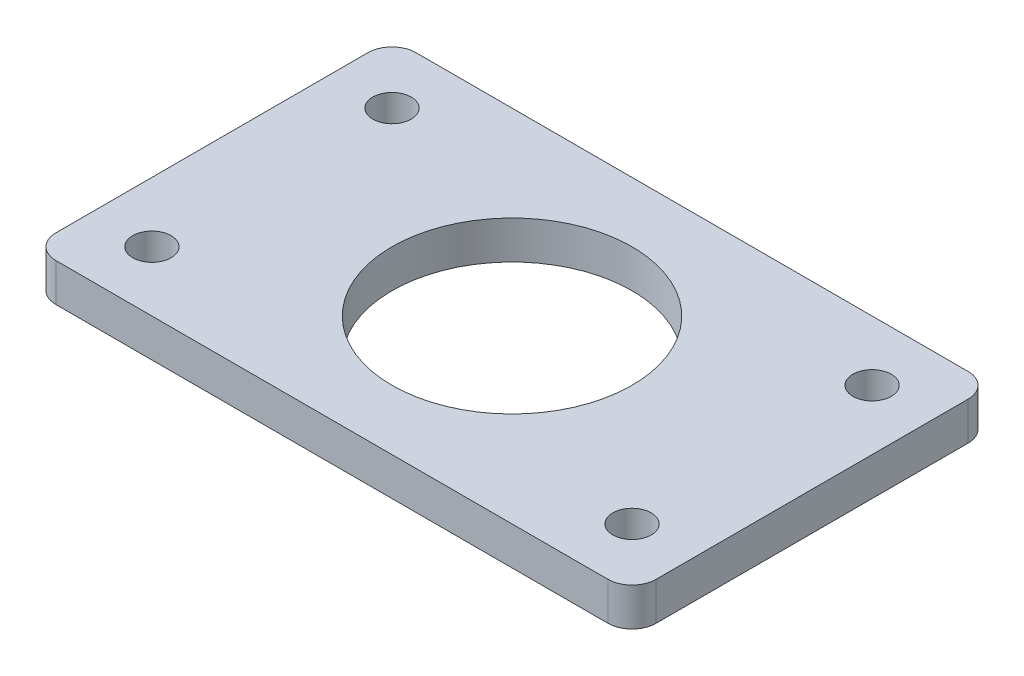
ISO-10303-21;
HEADER;
FILE_DESCRIPTION(('STEP AP214'),'2;1');
FILE_NAME('part.step','',(''),(''),'','','');
FILE_SCHEMA(('AUTOMOTIVE_DESIGN { 1 0 10303 214 1 1 1 1 }'));
ENDSEC;
DATA;
#1=APPLICATION_CONTEXT('core data for automotive mechanical design processes');
#2=APPLICATION_PROTOCOL_DEFINITION('international standard','automotive_design',2000,#1);
#3=PRODUCT_CONTEXT('',#1,'mechanical');
#4=PRODUCT('Part','Part','',(#3));
#5=PRODUCT_RELATED_PRODUCT_CATEGORY('part','',(#4));
#6=PRODUCT_DEFINITION_FORMATION('','',#4);
#7=PRODUCT_DEFINITION_CONTEXT('part definition',#1,'design');
#8=PRODUCT_DEFINITION('design','',#6,#7);
#9=PRODUCT_DEFINITION_SHAPE('','',#8);
#10=(LENGTH_UNIT() NAMED_UNIT(*) SI_UNIT(.MILLI.,.METRE.));
#11=(NAMED_UNIT(*) PLANE_ANGLE_UNIT() SI_UNIT($,.RADIAN.));
#12=(NAMED_UNIT(*) SI_UNIT($,.STERADIAN.) SOLID_ANGLE_UNIT());
#13=UNCERTAINTY_MEASURE_WITH_UNIT(LENGTH_MEASURE(1.E-05),#10,'distance_accuracy_value','');
#14=(GEOMETRIC_REPRESENTATION_CONTEXT(3) GLOBAL_UNCERTAINTY_ASSIGNED_CONTEXT((#13)) GLOBAL_UNIT_ASSIGNED_CONTEXT((#10,
#11,#12)) REPRESENTATION_CONTEXT('',''));
#15=CARTESIAN_POINT('',(0.,0.,0.));
#16=DIRECTION('',(0.,0.,1.));
#17=DIRECTION('',(1.,0.,0.));
#18=AXIS2_PLACEMENT_3D('',#15,#16,#17);
#19=CARTESIAN_POINT('',(0.,3.175,0.));
#20=DIRECTION('',(0.,1.,0.));
#21=DIRECTION('',(0.,0.,1.));
#22=AXIS2_PLACEMENT_3D('',#19,#20,#21);
#23=PLANE('',#22);
#24=CARTESIAN_POINT('',(-20.,3.175,-10.));
#25=DIRECTION('',(0.,1.,0.));
#26=DIRECTION('',(0.,0.,1.));
#27=AXIS2_PLACEMENT_3D('',#24,#25,#26);
#28=CIRCLE('',#27,1.6);
#29=CARTESIAN_POINT('',(-20.,3.175,-8.4));
#30=VERTEX_POINT('',#29);
#31=EDGE_CURVE('E207',#30,#30,#28,.T.);
#32=ORIENTED_EDGE('',*,*,#31,.F.);
#33=EDGE_LOOP('',(#32));
#34=FACE_BOUND('',#33,.T.);
#35=CARTESIAN_POINT('',(20.,3.175,10.));
#36=DIRECTION('',(0.,1.,0.));
#37=DIRECTION('',(0.,0.,1.));
#38=AXIS2_PLACEMENT_3D('',#35,#36,#37);
#39=CIRCLE('',#38,1.6);
#40=CARTESIAN_POINT('',(20.,3.175,11.6));
#41=VERTEX_POINT('',#40);
#42=EDGE_CURVE('E201',#41,#41,#39,.T.);
#43=ORIENTED_EDGE('',*,*,#42,.F.);
#44=EDGE_LOOP('',(#43));
#45=FACE_BOUND('',#44,.T.);
#46=CARTESIAN_POINT('',(20.,3.175,-10.));
#47=DIRECTION('',(0.,1.,0.));
#48=DIRECTION('',(0.,0.,1.));
#49=AXIS2_PLACEMENT_3D('',#46,#47,#48);
#50=CIRCLE('',#49,1.6);
#51=CARTESIAN_POINT('',(20.,3.175,-8.4));
#52=VERTEX_POINT('',#51);
#53=EDGE_CURVE('E195',#52,#52,#50,.T.);
#54=ORIENTED_EDGE('',*,*,#53,.F.);
#55=EDGE_LOOP('',(#54));
#56=FACE_BOUND('',#55,.T.);
#57=CARTESIAN_POINT('',(-20.,3.175,10.));
#58=DIRECTION('',(0.,1.,0.));
#59=DIRECTION('',(0.,0.,1.));
#60=AXIS2_PLACEMENT_3D('',#57,#58,#59);
#61=CIRCLE('',#60,1.6);
#62=CARTESIAN_POINT('',(-20.,3.175,11.6));
#63=VERTEX_POINT('',#62);
#64=EDGE_CURVE('E189',#63,#63,#61,.T.);
#65=ORIENTED_EDGE('',*,*,#64,.F.);
#66=EDGE_LOOP('',(#65));
#67=FACE_BOUND('',#66,.T.);
#68=DIRECTION('',(-1.,0.,0.));
#69=VECTOR('',#68,1.);
#70=CARTESIAN_POINT('',(25.,3.175,-15.));
#71=LINE('',#70,#69);
#72=CARTESIAN_POINT('',(23.,3.175,-15.));
#73=VERTEX_POINT('',#72);
#74=CARTESIAN_POINT('',(-23.,3.175,-15.));
#75=VERTEX_POINT('',#74);
#76=EDGE_CURVE('E140',#73,#75,#71,.T.);
#77=ORIENTED_EDGE('',*,*,#76,.T.);
#78=CARTESIAN_POINT('',(-23.,3.175,-13.));
#79=DIRECTION('',(0.,1.,0.));
#80=DIRECTION('',(0.,0.,1.));
#81=AXIS2_PLACEMENT_3D('',#78,#79,#80);
#82=CIRCLE('',#81,2.);
#83=CARTESIAN_POINT('',(-25.,3.175,-13.));
#84=VERTEX_POINT('',#83);
#85=EDGE_CURVE('E159',#75,#84,#82,.T.);
#86=ORIENTED_EDGE('',*,*,#85,.T.);
#87=DIRECTION('',(0.,0.,1.));
#88=VECTOR('',#87,1.);
#89=CARTESIAN_POINT('',(-25.,3.175,15.));
#90=LINE('',#89,#88);
#91=CARTESIAN_POINT('',(-25.,3.175,13.));
#92=VERTEX_POINT('',#91);
#93=EDGE_CURVE('E123',#84,#92,#90,.T.);
#94=ORIENTED_EDGE('',*,*,#93,.T.);
#95=CARTESIAN_POINT('',(-23.,3.175,13.));
#96=DIRECTION('',(0.,1.,0.));
#97=DIRECTION('',(0.,0.,1.));
#98=AXIS2_PLACEMENT_3D('',#95,#96,#97);
#99=CIRCLE('',#98,2.);
#100=CARTESIAN_POINT('',(-23.,3.175,15.));
#101=VERTEX_POINT('',#100);
#102=EDGE_CURVE('E154',#92,#101,#99,.T.);
#103=ORIENTED_EDGE('',*,*,#102,.T.);
#104=DIRECTION('',(1.,0.,0.));
#105=VECTOR('',#104,1.);
#106=CARTESIAN_POINT('',(25.,3.175,15.));
#107=LINE('',#106,#105);
#108=CARTESIAN_POINT('',(23.,3.175,15.));
#109=VERTEX_POINT('',#108);
#110=EDGE_CURVE('E170',#101,#109,#107,.T.);
#111=ORIENTED_EDGE('',*,*,#110,.T.);
#112=CARTESIAN_POINT('',(23.,3.175,13.));
#113=DIRECTION('',(0.,1.,0.));
#114=DIRECTION('',(0.,0.,1.));
#115=AXIS2_PLACEMENT_3D('',#112,#113,#114);
#116=CIRCLE('',#115,2.);
#117=CARTESIAN_POINT('',(25.,3.175,13.));
#118=VERTEX_POINT('',#117);
#119=EDGE_CURVE('E59',#109,#118,#116,.T.);
#120=ORIENTED_EDGE('',*,*,#119,.T.);
#121=DIRECTION('',(0.,0.,-1.));
#122=VECTOR('',#121,1.);
#123=CARTESIAN_POINT('',(25.,3.175,15.));
#124=LINE('',#123,#122);
#125=CARTESIAN_POINT('',(25.,3.175,-13.));
#126=VERTEX_POINT('',#125);
#127=EDGE_CURVE('E178',#118,#126,#124,.T.);
#128=ORIENTED_EDGE('',*,*,#127,.T.);
#129=CARTESIAN_POINT('',(23.,3.175,-13.));
#130=DIRECTION('',(0.,1.,0.));
#131=DIRECTION('',(0.,0.,1.));
#132=AXIS2_PLACEMENT_3D('',#129,#130,#131);
#133=CIRCLE('',#132,2.);
#134=EDGE_CURVE('E157',#126,#73,#133,.T.);
#135=ORIENTED_EDGE('',*,*,#134,.T.);
#136=EDGE_LOOP('',(#77,#86,#94,#103,#111,#120,#128,#135));
#137=FACE_BOUND('',#136,.T.);
#138=CARTESIAN_POINT('',(0.,3.175,0.));
#139=DIRECTION('',(0.,1.,0.));
#140=DIRECTION('',(0.,0.,1.));
#141=AXIS2_PLACEMENT_3D('',#138,#139,#140);
#142=CIRCLE('',#141,10.);
#143=CARTESIAN_POINT('',(0.,3.175,10.));
#144=VERTEX_POINT('',#143);
#145=EDGE_CURVE('E131',#144,#144,#142,.T.);
#146=ORIENTED_EDGE('',*,*,#145,.F.);
#147=EDGE_LOOP('',(#146));
#148=FACE_BOUND('',#147,.T.);
#149=ADVANCED_FACE('F37',(#34,#45,#56,#67,#137,#148),#23,.T.);
#150=CARTESIAN_POINT('',(0.,0.,0.));
#151=DIRECTION('',(0.,1.,0.));
#152=DIRECTION('',(0.,0.,1.));
#153=AXIS2_PLACEMENT_3D('',#150,#151,#152);
#154=PLANE('',#153);
#155=CARTESIAN_POINT('',(-20.,0.,-10.));
#156=DIRECTION('',(0.,1.,0.));
#157=DIRECTION('',(0.,0.,1.));
#158=AXIS2_PLACEMENT_3D('',#155,#156,#157);
#159=CIRCLE('',#158,1.6);
#160=CARTESIAN_POINT('',(-20.,0.,-8.4));
#161=VERTEX_POINT('',#160);
#162=EDGE_CURVE('E204',#161,#161,#159,.T.);
#163=ORIENTED_EDGE('',*,*,#162,.T.);
#164=EDGE_LOOP('',(#163));
#165=FACE_BOUND('',#164,.T.);
#166=CARTESIAN_POINT('',(20.,0.,10.));
#167=DIRECTION('',(0.,1.,0.));
#168=DIRECTION('',(0.,0.,1.));
#169=AXIS2_PLACEMENT_3D('',#166,#167,#168);
#170=CIRCLE('',#169,1.6);
#171=CARTESIAN_POINT('',(20.,0.,11.6));
#172=VERTEX_POINT('',#171);
#173=EDGE_CURVE('E198',#172,#172,#170,.T.);
#174=ORIENTED_EDGE('',*,*,#173,.T.);
#175=EDGE_LOOP('',(#174));
#176=FACE_BOUND('',#175,.T.);
#177=CARTESIAN_POINT('',(20.,0.,-10.));
#178=DIRECTION('',(0.,1.,0.));
#179=DIRECTION('',(0.,0.,1.));
#180=AXIS2_PLACEMENT_3D('',#177,#178,#179);
#181=CIRCLE('',#180,1.6);
#182=CARTESIAN_POINT('',(20.,0.,-8.4));
#183=VERTEX_POINT('',#182);
#184=EDGE_CURVE('E192',#183,#183,#181,.T.);
#185=ORIENTED_EDGE('',*,*,#184,.T.);
#186=EDGE_LOOP('',(#185));
#187=FACE_BOUND('',#186,.T.);
#188=CARTESIAN_POINT('',(-20.,0.,10.));
#189=DIRECTION('',(0.,1.,0.));
#190=DIRECTION('',(0.,0.,1.));
#191=AXIS2_PLACEMENT_3D('',#188,#189,#190);
#192=CIRCLE('',#191,1.6);
#193=CARTESIAN_POINT('',(-20.,0.,11.6));
#194=VERTEX_POINT('',#193);
#195=EDGE_CURVE('E185',#194,#194,#192,.T.);
#196=ORIENTED_EDGE('',*,*,#195,.T.);
#197=EDGE_LOOP('',(#196));
#198=FACE_BOUND('',#197,.T.);
#199=DIRECTION('',(0.,0.,1.));
#200=VECTOR('',#199,1.);
#201=CARTESIAN_POINT('',(-25.,0.,15.));
#202=LINE('',#201,#200);
#203=CARTESIAN_POINT('',(-25.,0.,-13.));
#204=VERTEX_POINT('',#203);
#205=CARTESIAN_POINT('',(-25.,0.,13.));
#206=VERTEX_POINT('',#205);
#207=EDGE_CURVE('E120',#204,#206,#202,.T.);
#208=ORIENTED_EDGE('',*,*,#207,.F.);
#209=CARTESIAN_POINT('',(-23.,0.,-13.));
#210=DIRECTION('',(0.,1.,0.));
#211=DIRECTION('',(0.,0.,1.));
#212=AXIS2_PLACEMENT_3D('',#209,#210,#211);
#213=CIRCLE('',#212,2.);
#214=CARTESIAN_POINT('',(-23.,0.,-15.));
#215=VERTEX_POINT('',#214);
#216=EDGE_CURVE('E103',#204,#215,#213,.F.);
#217=ORIENTED_EDGE('',*,*,#216,.T.);
#218=DIRECTION('',(-1.,0.,0.));
#219=VECTOR('',#218,1.);
#220=CARTESIAN_POINT('',(25.,0.,-15.));
#221=LINE('',#220,#219);
#222=CARTESIAN_POINT('',(23.,0.,-15.));
#223=VERTEX_POINT('',#222);
#224=EDGE_CURVE('E144',#223,#215,#221,.T.);
#225=ORIENTED_EDGE('',*,*,#224,.F.);
#226=CARTESIAN_POINT('',(23.,0.,-13.));
#227=DIRECTION('',(0.,1.,0.));
#228=DIRECTION('',(0.,0.,1.));
#229=AXIS2_PLACEMENT_3D('',#226,#227,#228);
#230=CIRCLE('',#229,2.);
#231=CARTESIAN_POINT('',(25.,0.,-13.));
#232=VERTEX_POINT('',#231);
#233=EDGE_CURVE('E114',#223,#232,#230,.F.);
#234=ORIENTED_EDGE('',*,*,#233,.T.);
#235=DIRECTION('',(0.,0.,-1.));
#236=VECTOR('',#235,1.);
#237=CARTESIAN_POINT('',(25.,0.,15.));
#238=LINE('',#237,#236);
#239=CARTESIAN_POINT('',(25.,0.,13.));
#240=VERTEX_POINT('',#239);
#241=EDGE_CURVE('E134',#240,#232,#238,.T.);
#242=ORIENTED_EDGE('',*,*,#241,.F.);
#243=CARTESIAN_POINT('',(23.,0.,13.));
#244=DIRECTION('',(0.,1.,0.));
#245=DIRECTION('',(0.,0.,1.));
#246=AXIS2_PLACEMENT_3D('',#243,#244,#245);
#247=CIRCLE('',#246,2.);
#248=CARTESIAN_POINT('',(23.,0.,15.));
#249=VERTEX_POINT('',#248);
#250=EDGE_CURVE('E148',#240,#249,#247,.F.);
#251=ORIENTED_EDGE('',*,*,#250,.T.);
#252=DIRECTION('',(1.,0.,0.));
#253=VECTOR('',#252,1.);
#254=CARTESIAN_POINT('',(25.,0.,15.));
#255=LINE('',#254,#253);
#256=CARTESIAN_POINT('',(-23.,0.,15.));
#257=VERTEX_POINT('',#256);
#258=EDGE_CURVE('E130',#257,#249,#255,.T.);
#259=ORIENTED_EDGE('',*,*,#258,.F.);
#260=CARTESIAN_POINT('',(-23.,0.,13.));
#261=DIRECTION('',(0.,1.,0.));
#262=DIRECTION('',(0.,0.,1.));
#263=AXIS2_PLACEMENT_3D('',#260,#261,#262);
#264=CIRCLE('',#263,2.);
#265=EDGE_CURVE('E124',#257,#206,#264,.F.);
#266=ORIENTED_EDGE('',*,*,#265,.T.);
#267=EDGE_LOOP('',(#208,#217,#225,#234,#242,#251,#259,#266));
#268=FACE_BOUND('',#267,.T.);
#269=CARTESIAN_POINT('',(0.,0.,0.));
#270=DIRECTION('',(0.,1.,0.));
#271=DIRECTION('',(0.,0.,1.));
#272=AXIS2_PLACEMENT_3D('',#269,#270,#271);
#273=CIRCLE('',#272,10.);
#274=CARTESIAN_POINT('',(0.,0.,10.));
#275=VERTEX_POINT('',#274);
#276=EDGE_CURVE('E137',#275,#275,#273,.T.);
#277=ORIENTED_EDGE('',*,*,#276,.T.);
#278=EDGE_LOOP('',(#277));
#279=FACE_BOUND('',#278,.T.);
#280=ADVANCED_FACE('F127',(#165,#176,#187,#198,#268,#279),#154,.F.);
#281=CARTESIAN_POINT('',(-25.,3.175,15.));
#282=DIRECTION('',(1.,0.,0.));
#283=DIRECTION('',(0.,0.,-1.));
#284=AXIS2_PLACEMENT_3D('',#281,#282,#283);
#285=PLANE('',#284);
#286=ORIENTED_EDGE('',*,*,#93,.F.);
#287=DIRECTION('',(0.,-1.,0.));
#288=VECTOR('',#287,1.);
#289=CARTESIAN_POINT('',(-25.,3.175,-13.));
#290=LINE('',#289,#288);
#291=EDGE_CURVE('E107',#84,#204,#290,.T.);
#292=ORIENTED_EDGE('',*,*,#291,.T.);
#293=ORIENTED_EDGE('',*,*,#207,.T.);
#294=DIRECTION('',(0.,-1.,0.));
#295=VECTOR('',#294,1.);
#296=CARTESIAN_POINT('',(-25.,3.175,13.));
#297=LINE('',#296,#295);
#298=EDGE_CURVE('E125',#206,#92,#297,.F.);
#299=ORIENTED_EDGE('',*,*,#298,.T.);
#300=EDGE_LOOP('',(#286,#292,#293,#299));
#301=FACE_BOUND('',#300,.T.);
#302=ADVANCED_FACE('F119',(#301),#285,.F.);
#303=CARTESIAN_POINT('',(25.,3.175,15.));
#304=DIRECTION('',(0.,0.,-1.));
#305=DIRECTION('',(-1.,0.,0.));
#306=AXIS2_PLACEMENT_3D('',#303,#304,#305);
#307=PLANE('',#306);
#308=ORIENTED_EDGE('',*,*,#258,.T.);
#309=DIRECTION('',(0.,-1.,0.));
#310=VECTOR('',#309,1.);
#311=CARTESIAN_POINT('',(23.,3.175,15.));
#312=LINE('',#311,#310);
#313=EDGE_CURVE('E11',#249,#109,#312,.F.);
#314=ORIENTED_EDGE('',*,*,#313,.T.);
#315=ORIENTED_EDGE('',*,*,#110,.F.);
#316=DIRECTION('',(0.,-1.,0.));
#317=VECTOR('',#316,1.);
#318=CARTESIAN_POINT('',(-23.,3.175,15.));
#319=LINE('',#318,#317);
#320=EDGE_CURVE('E45',#101,#257,#319,.T.);
#321=ORIENTED_EDGE('',*,*,#320,.T.);
#322=EDGE_LOOP('',(#308,#314,#315,#321));
#323=FACE_BOUND('',#322,.T.);
#324=ADVANCED_FACE('F168',(#323),#307,.F.);
#325=CARTESIAN_POINT('',(25.,3.175,15.));
#326=DIRECTION('',(-1.,0.,0.));
#327=DIRECTION('',(0.,0.,1.));
#328=AXIS2_PLACEMENT_3D('',#325,#326,#327);
#329=PLANE('',#328);
#330=ORIENTED_EDGE('',*,*,#241,.T.);
#331=DIRECTION('',(0.,-1.,0.));
#332=VECTOR('',#331,1.);
#333=CARTESIAN_POINT('',(25.,3.175,-13.));
#334=LINE('',#333,#332);
#335=EDGE_CURVE('E52',#232,#126,#334,.F.);
#336=ORIENTED_EDGE('',*,*,#335,.T.);
#337=ORIENTED_EDGE('',*,*,#127,.F.);
#338=DIRECTION('',(0.,-1.,0.));
#339=VECTOR('',#338,1.);
#340=CARTESIAN_POINT('',(25.,3.175,13.));
#341=LINE('',#340,#339);
#342=EDGE_CURVE('E161',#118,#240,#341,.T.);
#343=ORIENTED_EDGE('',*,*,#342,.T.);
#344=EDGE_LOOP('',(#330,#336,#337,#343));
#345=FACE_BOUND('',#344,.T.);
#346=ADVANCED_FACE('F177',(#345),#329,.F.);
#347=CARTESIAN_POINT('',(25.,3.175,-15.));
#348=DIRECTION('',(0.,0.,1.));
#349=DIRECTION('',(1.,0.,0.));
#350=AXIS2_PLACEMENT_3D('',#347,#348,#349);
#351=PLANE('',#350);
#352=ORIENTED_EDGE('',*,*,#224,.T.);
#353=DIRECTION('',(0.,-1.,0.));
#354=VECTOR('',#353,1.);
#355=CARTESIAN_POINT('',(-23.,3.175,-15.));
#356=LINE('',#355,#354);
#357=EDGE_CURVE('E108',#215,#75,#356,.F.);
#358=ORIENTED_EDGE('',*,*,#357,.T.);
#359=ORIENTED_EDGE('',*,*,#76,.F.);
#360=DIRECTION('',(0.,-1.,0.));
#361=VECTOR('',#360,1.);
#362=CARTESIAN_POINT('',(23.,3.175,-15.));
#363=LINE('',#362,#361);
#364=EDGE_CURVE('E113',#73,#223,#363,.T.);
#365=ORIENTED_EDGE('',*,*,#364,.T.);
#366=EDGE_LOOP('',(#352,#358,#359,#365));
#367=FACE_BOUND('',#366,.T.);
#368=ADVANCED_FACE('F229',(#367),#351,.F.);
#369=CARTESIAN_POINT('',(0.,3.175,0.));
#370=DIRECTION('',(0.,-1.,0.));
#371=DIRECTION('',(0.,0.,-1.));
#372=AXIS2_PLACEMENT_3D('',#369,#370,#371);
#373=CYLINDRICAL_SURFACE('',#372,10.);
#374=ORIENTED_EDGE('',*,*,#145,.T.);
#375=EDGE_LOOP('',(#374));
#376=FACE_BOUND('',#375,.T.);
#377=ORIENTED_EDGE('',*,*,#276,.F.);
#378=EDGE_LOOP('',(#377));
#379=FACE_BOUND('',#378,.T.);
#380=ADVANCED_FACE('F225',(#376,#379),#373,.F.);
#381=CARTESIAN_POINT('',(-20.,3.175,10.));
#382=DIRECTION('',(0.,1.,0.));
#383=DIRECTION('',(0.,0.,1.));
#384=AXIS2_PLACEMENT_3D('',#381,#382,#383);
#385=CYLINDRICAL_SURFACE('',#384,1.6);
#386=ORIENTED_EDGE('',*,*,#195,.F.);
#387=EDGE_LOOP('',(#386));
#388=FACE_BOUND('',#387,.T.);
#389=ORIENTED_EDGE('',*,*,#64,.T.);
#390=EDGE_LOOP('',(#389));
#391=FACE_BOUND('',#390,.T.);
#392=ADVANCED_FACE('F228',(#388,#391),#385,.F.);
#393=CARTESIAN_POINT('',(20.,3.175,-10.));
#394=DIRECTION('',(0.,1.,0.));
#395=DIRECTION('',(0.,0.,1.));
#396=AXIS2_PLACEMENT_3D('',#393,#394,#395);
#397=CYLINDRICAL_SURFACE('',#396,1.6);
#398=ORIENTED_EDGE('',*,*,#184,.F.);
#399=EDGE_LOOP('',(#398));
#400=FACE_BOUND('',#399,.T.);
#401=ORIENTED_EDGE('',*,*,#53,.T.);
#402=EDGE_LOOP('',(#401));
#403=FACE_BOUND('',#402,.T.);
#404=ADVANCED_FACE('F340',(#400,#403),#397,.F.);
#405=CARTESIAN_POINT('',(20.,3.175,10.));
#406=DIRECTION('',(0.,1.,0.));
#407=DIRECTION('',(0.,0.,1.));
#408=AXIS2_PLACEMENT_3D('',#405,#406,#407);
#409=CYLINDRICAL_SURFACE('',#408,1.6);
#410=ORIENTED_EDGE('',*,*,#173,.F.);
#411=EDGE_LOOP('',(#410));
#412=FACE_BOUND('',#411,.T.);
#413=ORIENTED_EDGE('',*,*,#42,.T.);
#414=EDGE_LOOP('',(#413));
#415=FACE_BOUND('',#414,.T.);
#416=ADVANCED_FACE('F329',(#412,#415),#409,.F.);
#417=CARTESIAN_POINT('',(-20.,3.175,-10.));
#418=DIRECTION('',(0.,1.,0.));
#419=DIRECTION('',(0.,0.,1.));
#420=AXIS2_PLACEMENT_3D('',#417,#418,#419);
#421=CYLINDRICAL_SURFACE('',#420,1.6);
#422=ORIENTED_EDGE('',*,*,#162,.F.);
#423=EDGE_LOOP('',(#422));
#424=FACE_BOUND('',#423,.T.);
#425=ORIENTED_EDGE('',*,*,#31,.T.);
#426=EDGE_LOOP('',(#425));
#427=FACE_BOUND('',#426,.T.);
#428=ADVANCED_FACE('F211',(#424,#427),#421,.F.);
#429=CARTESIAN_POINT('',(-23.,3.175,-13.));
#430=DIRECTION('',(0.,-1.,0.));
#431=DIRECTION('',(0.,0.,-1.));
#432=AXIS2_PLACEMENT_3D('',#429,#430,#431);
#433=CYLINDRICAL_SURFACE('',#432,2.);
#434=ORIENTED_EDGE('',*,*,#85,.F.);
#435=ORIENTED_EDGE('',*,*,#357,.F.);
#436=ORIENTED_EDGE('',*,*,#216,.F.);
#437=ORIENTED_EDGE('',*,*,#291,.F.);
#438=EDGE_LOOP('',(#434,#435,#436,#437));
#439=FACE_BOUND('',#438,.T.);
#440=ADVANCED_FACE('F106',(#439),#433,.T.);
#441=CARTESIAN_POINT('',(23.,3.175,-13.));
#442=DIRECTION('',(0.,-1.,0.));
#443=DIRECTION('',(0.,0.,-1.));
#444=AXIS2_PLACEMENT_3D('',#441,#442,#443);
#445=CYLINDRICAL_SURFACE('',#444,2.);
#446=ORIENTED_EDGE('',*,*,#134,.F.);
#447=ORIENTED_EDGE('',*,*,#335,.F.);
#448=ORIENTED_EDGE('',*,*,#233,.F.);
#449=ORIENTED_EDGE('',*,*,#364,.F.);
#450=EDGE_LOOP('',(#446,#447,#448,#449));
#451=FACE_BOUND('',#450,.T.);
#452=ADVANCED_FACE('F250',(#451),#445,.T.);
#453=CARTESIAN_POINT('',(23.,3.175,13.));
#454=DIRECTION('',(0.,-1.,0.));
#455=DIRECTION('',(0.,0.,-1.));
#456=AXIS2_PLACEMENT_3D('',#453,#454,#455);
#457=CYLINDRICAL_SURFACE('',#456,2.);
#458=ORIENTED_EDGE('',*,*,#119,.F.);
#459=ORIENTED_EDGE('',*,*,#313,.F.);
#460=ORIENTED_EDGE('',*,*,#250,.F.);
#461=ORIENTED_EDGE('',*,*,#342,.F.);
#462=EDGE_LOOP('',(#458,#459,#460,#461));
#463=FACE_BOUND('',#462,.T.);
#464=ADVANCED_FACE('F176',(#463),#457,.T.);
#465=CARTESIAN_POINT('',(-23.,3.175,13.));
#466=DIRECTION('',(0.,-1.,0.));
#467=DIRECTION('',(0.,0.,-1.));
#468=AXIS2_PLACEMENT_3D('',#465,#466,#467);
#469=CYLINDRICAL_SURFACE('',#468,2.);
#470=ORIENTED_EDGE('',*,*,#102,.F.);
#471=ORIENTED_EDGE('',*,*,#298,.F.);
#472=ORIENTED_EDGE('',*,*,#265,.F.);
#473=ORIENTED_EDGE('',*,*,#320,.F.);
#474=EDGE_LOOP('',(#470,#471,#472,#473));
#475=FACE_BOUND('',#474,.T.);
#476=ADVANCED_FACE('F39',(#475),#469,.T.);
#477=CLOSED_SHELL('',(#149,#280,#302,#324,#346,#368,#380,#392,#404,#416,#428,#440,#452,#464,#476));
#478=MANIFOLD_SOLID_BREP('B2',#477);
#479=ADVANCED_BREP_SHAPE_REPRESENTATION('',(#18,#478),#14);
#480=SHAPE_DEFINITION_REPRESENTATION(#9,#479);
ENDSEC;
END-ISO-10303-21;
